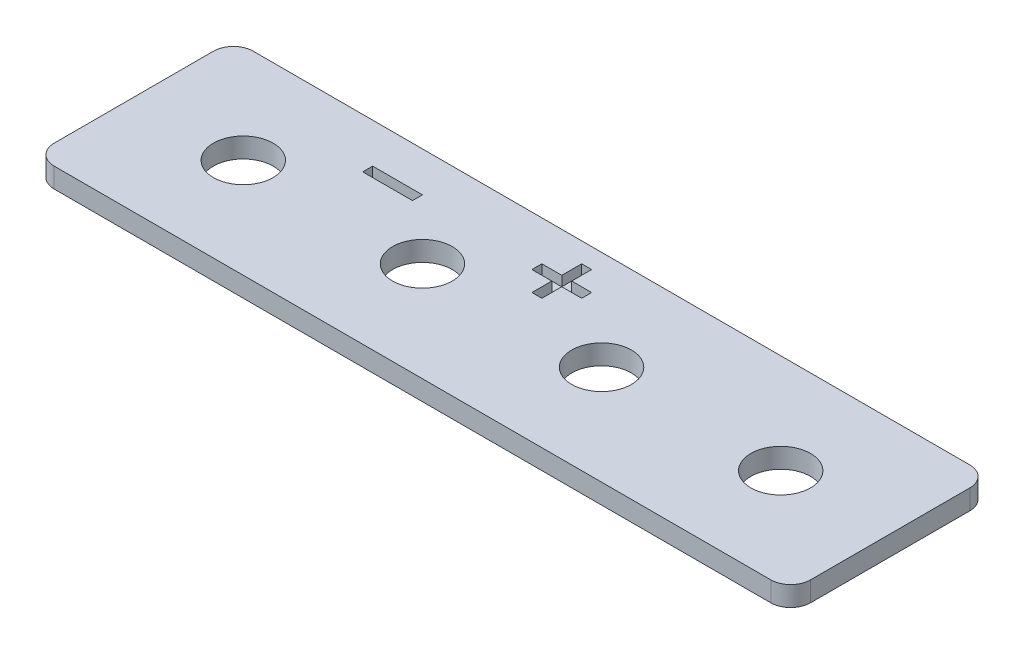
ISO-10303-21;
HEADER;
FILE_DESCRIPTION(('STEP AP214'),'2;1');
FILE_NAME('part.step','',(''),(''),'','','');
FILE_SCHEMA(('AUTOMOTIVE_DESIGN { 1 0 10303 214 1 1 1 1 }'));
ENDSEC;
DATA;
#1=APPLICATION_CONTEXT('core data for automotive mechanical design processes');
#2=APPLICATION_PROTOCOL_DEFINITION('international standard','automotive_design',2000,#1);
#3=PRODUCT_CONTEXT('',#1,'mechanical');
#4=PRODUCT('Part','Part','',(#3));
#5=PRODUCT_RELATED_PRODUCT_CATEGORY('part','',(#4));
#6=PRODUCT_DEFINITION_FORMATION('','',#4);
#7=PRODUCT_DEFINITION_CONTEXT('part definition',#1,'design');
#8=PRODUCT_DEFINITION('design','',#6,#7);
#9=PRODUCT_DEFINITION_SHAPE('','',#8);
#10=(LENGTH_UNIT() NAMED_UNIT(*) SI_UNIT(.MILLI.,.METRE.));
#11=(NAMED_UNIT(*) PLANE_ANGLE_UNIT() SI_UNIT($,.RADIAN.));
#12=(NAMED_UNIT(*) SI_UNIT($,.STERADIAN.) SOLID_ANGLE_UNIT());
#13=UNCERTAINTY_MEASURE_WITH_UNIT(LENGTH_MEASURE(1.E-05),#10,'distance_accuracy_value','');
#14=(GEOMETRIC_REPRESENTATION_CONTEXT(3) GLOBAL_UNCERTAINTY_ASSIGNED_CONTEXT((#13)) GLOBAL_UNIT_ASSIGNED_CONTEXT((#10,
#11,#12)) REPRESENTATION_CONTEXT('',''));
#15=CARTESIAN_POINT('',(0.,0.,0.));
#16=DIRECTION('',(0.,0.,1.));
#17=DIRECTION('',(1.,0.,0.));
#18=AXIS2_PLACEMENT_3D('',#15,#16,#17);
#19=CARTESIAN_POINT('',(19.,1.,5.));
#20=DIRECTION('',(-1.,0.,0.));
#21=DIRECTION('',(0.,0.,1.));
#22=AXIS2_PLACEMENT_3D('',#19,#20,#21);
#23=PLANE('',#22);
#24=DIRECTION('',(0.,0.,-1.));
#25=VECTOR('',#24,1.);
#26=CARTESIAN_POINT('',(19.,0.,5.));
#27=LINE('',#26,#25);
#28=CARTESIAN_POINT('',(19.,0.,4.));
#29=VERTEX_POINT('',#28);
#30=CARTESIAN_POINT('',(19.,0.,-4.));
#31=VERTEX_POINT('',#30);
#32=EDGE_CURVE('E350',#29,#31,#27,.T.);
#33=ORIENTED_EDGE('',*,*,#32,.T.);
#34=DIRECTION('',(0.,-1.,0.));
#35=VECTOR('',#34,1.);
#36=CARTESIAN_POINT('',(19.,1.,-4.));
#37=LINE('',#36,#35);
#38=CARTESIAN_POINT('',(19.,1.,-4.));
#39=VERTEX_POINT('',#38);
#40=EDGE_CURVE('E11',#31,#39,#37,.F.);
#41=ORIENTED_EDGE('',*,*,#40,.T.);
#42=DIRECTION('',(0.,0.,-1.));
#43=VECTOR('',#42,1.);
#44=CARTESIAN_POINT('',(19.,1.,5.));
#45=LINE('',#44,#43);
#46=CARTESIAN_POINT('',(19.,1.,4.));
#47=VERTEX_POINT('',#46);
#48=EDGE_CURVE('E353',#47,#39,#45,.T.);
#49=ORIENTED_EDGE('',*,*,#48,.F.);
#50=DIRECTION('',(0.,-1.,0.));
#51=VECTOR('',#50,1.);
#52=CARTESIAN_POINT('',(19.,1.,4.));
#53=LINE('',#52,#51);
#54=EDGE_CURVE('E44',#47,#29,#53,.T.);
#55=ORIENTED_EDGE('',*,*,#54,.T.);
#56=EDGE_LOOP('',(#33,#41,#49,#55));
#57=FACE_BOUND('',#56,.T.);
#58=ADVANCED_FACE('F36',(#57),#23,.F.);
#59=CARTESIAN_POINT('',(-19.,1.,-5.));
#60=DIRECTION('',(0.,0.,1.));
#61=DIRECTION('',(1.,0.,0.));
#62=AXIS2_PLACEMENT_3D('',#59,#60,#61);
#63=PLANE('',#62);
#64=DIRECTION('',(-1.,0.,0.));
#65=VECTOR('',#64,1.);
#66=CARTESIAN_POINT('',(-19.,0.,-5.));
#67=LINE('',#66,#65);
#68=CARTESIAN_POINT('',(18.,0.,-5.));
#69=VERTEX_POINT('',#68);
#70=CARTESIAN_POINT('',(-18.,0.,-5.));
#71=VERTEX_POINT('',#70);
#72=EDGE_CURVE('E369',#69,#71,#67,.T.);
#73=ORIENTED_EDGE('',*,*,#72,.T.);
#74=DIRECTION('',(0.,-1.,0.));
#75=VECTOR('',#74,1.);
#76=CARTESIAN_POINT('',(-18.,1.,-5.));
#77=LINE('',#76,#75);
#78=CARTESIAN_POINT('',(-18.,1.,-5.));
#79=VERTEX_POINT('',#78);
#80=EDGE_CURVE('E392',#71,#79,#77,.F.);
#81=ORIENTED_EDGE('',*,*,#80,.T.);
#82=DIRECTION('',(-1.,0.,0.));
#83=VECTOR('',#82,1.);
#84=CARTESIAN_POINT('',(-19.,1.,-5.));
#85=LINE('',#84,#83);
#86=CARTESIAN_POINT('',(18.,1.,-5.));
#87=VERTEX_POINT('',#86);
#88=EDGE_CURVE('E356',#87,#79,#85,.T.);
#89=ORIENTED_EDGE('',*,*,#88,.F.);
#90=DIRECTION('',(0.,-1.,0.));
#91=VECTOR('',#90,1.);
#92=CARTESIAN_POINT('',(18.,1.,-5.));
#93=LINE('',#92,#91);
#94=EDGE_CURVE('E389',#87,#69,#93,.T.);
#95=ORIENTED_EDGE('',*,*,#94,.T.);
#96=EDGE_LOOP('',(#73,#81,#89,#95));
#97=FACE_BOUND('',#96,.T.);
#98=ADVANCED_FACE('F425',(#97),#63,.F.);
#99=CARTESIAN_POINT('',(-19.,1.,5.));
#100=DIRECTION('',(1.,0.,0.));
#101=DIRECTION('',(0.,0.,-1.));
#102=AXIS2_PLACEMENT_3D('',#99,#100,#101);
#103=PLANE('',#102);
#104=DIRECTION('',(0.,0.,1.));
#105=VECTOR('',#104,1.);
#106=CARTESIAN_POINT('',(-19.,1.,5.));
#107=LINE('',#106,#105);
#108=CARTESIAN_POINT('',(-19.,1.,-4.));
#109=VERTEX_POINT('',#108);
#110=CARTESIAN_POINT('',(-19.,1.,4.));
#111=VERTEX_POINT('',#110);
#112=EDGE_CURVE('E360',#109,#111,#107,.T.);
#113=ORIENTED_EDGE('',*,*,#112,.F.);
#114=DIRECTION('',(0.,-1.,0.));
#115=VECTOR('',#114,1.);
#116=CARTESIAN_POINT('',(-19.,1.,-4.));
#117=LINE('',#116,#115);
#118=CARTESIAN_POINT('',(-19.,0.,-4.));
#119=VERTEX_POINT('',#118);
#120=EDGE_CURVE('E378',#109,#119,#117,.T.);
#121=ORIENTED_EDGE('',*,*,#120,.T.);
#122=DIRECTION('',(0.,0.,1.));
#123=VECTOR('',#122,1.);
#124=CARTESIAN_POINT('',(-19.,0.,5.));
#125=LINE('',#124,#123);
#126=CARTESIAN_POINT('',(-19.,0.,4.));
#127=VERTEX_POINT('',#126);
#128=EDGE_CURVE('E372',#119,#127,#125,.T.);
#129=ORIENTED_EDGE('',*,*,#128,.T.);
#130=DIRECTION('',(0.,-1.,0.));
#131=VECTOR('',#130,1.);
#132=CARTESIAN_POINT('',(-19.,1.,4.));
#133=LINE('',#132,#131);
#134=EDGE_CURVE('E366',#127,#111,#133,.F.);
#135=ORIENTED_EDGE('',*,*,#134,.T.);
#136=EDGE_LOOP('',(#113,#121,#129,#135));
#137=FACE_BOUND('',#136,.T.);
#138=ADVANCED_FACE('F435',(#137),#103,.F.);
#139=CARTESIAN_POINT('',(-19.,1.,5.));
#140=DIRECTION('',(0.,0.,-1.));
#141=DIRECTION('',(-1.,0.,0.));
#142=AXIS2_PLACEMENT_3D('',#139,#140,#141);
#143=PLANE('',#142);
#144=DIRECTION('',(1.,0.,0.));
#145=VECTOR('',#144,1.);
#146=CARTESIAN_POINT('',(-19.,1.,5.));
#147=LINE('',#146,#145);
#148=CARTESIAN_POINT('',(-18.,1.,5.));
#149=VERTEX_POINT('',#148);
#150=CARTESIAN_POINT('',(18.,1.,5.));
#151=VERTEX_POINT('',#150);
#152=EDGE_CURVE('E363',#149,#151,#147,.T.);
#153=ORIENTED_EDGE('',*,*,#152,.F.);
#154=DIRECTION('',(0.,-1.,0.));
#155=VECTOR('',#154,1.);
#156=CARTESIAN_POINT('',(-18.,1.,5.));
#157=LINE('',#156,#155);
#158=CARTESIAN_POINT('',(-18.,0.,5.));
#159=VERTEX_POINT('',#158);
#160=EDGE_CURVE('E404',#149,#159,#157,.T.);
#161=ORIENTED_EDGE('',*,*,#160,.T.);
#162=DIRECTION('',(1.,0.,0.));
#163=VECTOR('',#162,1.);
#164=CARTESIAN_POINT('',(-19.,0.,5.));
#165=LINE('',#164,#163);
#166=CARTESIAN_POINT('',(18.,0.,5.));
#167=VERTEX_POINT('',#166);
#168=EDGE_CURVE('E357',#159,#167,#165,.T.);
#169=ORIENTED_EDGE('',*,*,#168,.T.);
#170=DIRECTION('',(0.,-1.,0.));
#171=VECTOR('',#170,1.);
#172=CARTESIAN_POINT('',(18.,1.,5.));
#173=LINE('',#172,#171);
#174=EDGE_CURVE('E402',#167,#151,#173,.F.);
#175=ORIENTED_EDGE('',*,*,#174,.T.);
#176=EDGE_LOOP('',(#153,#161,#169,#175));
#177=FACE_BOUND('',#176,.T.);
#178=ADVANCED_FACE('F443',(#177),#143,.F.);
#179=CARTESIAN_POINT('',(0.,1.,0.));
#180=DIRECTION('',(0.,-1.,0.));
#181=DIRECTION('',(0.,0.,-1.));
#182=AXIS2_PLACEMENT_3D('',#179,#180,#181);
#183=PLANE('',#182);
#184=DIRECTION('',(1.,0.,0.));
#185=VECTOR('',#184,1.);
#186=CARTESIAN_POINT('',(-1.5,1.,-2.5));
#187=LINE('',#186,#185);
#188=CARTESIAN_POINT('',(-1.5,1.,-2.5));
#189=VERTEX_POINT('',#188);
#190=CARTESIAN_POINT('',(-0.499999999999998,1.,-2.5));
#191=VERTEX_POINT('',#190);
#192=EDGE_CURVE('E249',#189,#191,#187,.T.);
#193=ORIENTED_EDGE('',*,*,#192,.F.);
#194=DIRECTION('',(0.,0.,1.));
#195=VECTOR('',#194,1.);
#196=CARTESIAN_POINT('',(-1.5,1.,-3.));
#197=LINE('',#196,#195);
#198=CARTESIAN_POINT('',(-1.5,1.,-3.));
#199=VERTEX_POINT('',#198);
#200=EDGE_CURVE('E51',#199,#189,#197,.T.);
#201=ORIENTED_EDGE('',*,*,#200,.F.);
#202=DIRECTION('',(-1.,0.,0.));
#203=VECTOR('',#202,1.);
#204=CARTESIAN_POINT('',(-1.5,1.,-3.));
#205=LINE('',#204,#203);
#206=CARTESIAN_POINT('',(-0.499999999999998,1.,-3.));
#207=VERTEX_POINT('',#206);
#208=EDGE_CURVE('E217',#207,#199,#205,.T.);
#209=ORIENTED_EDGE('',*,*,#208,.F.);
#210=DIRECTION('',(0.,0.,1.));
#211=VECTOR('',#210,1.);
#212=CARTESIAN_POINT('',(-0.499999999999998,1.,-4.));
#213=LINE('',#212,#211);
#214=CARTESIAN_POINT('',(-0.499999999999998,1.,-4.));
#215=VERTEX_POINT('',#214);
#216=EDGE_CURVE('E220',#215,#207,#213,.T.);
#217=ORIENTED_EDGE('',*,*,#216,.F.);
#218=DIRECTION('',(-1.,0.,0.));
#219=VECTOR('',#218,1.);
#220=CARTESIAN_POINT('',(-0.499999999999998,1.,-4.));
#221=LINE('',#220,#219);
#222=CARTESIAN_POINT('',(0.,1.,-4.));
#223=VERTEX_POINT('',#222);
#224=EDGE_CURVE('E272',#223,#215,#221,.T.);
#225=ORIENTED_EDGE('',*,*,#224,.F.);
#226=DIRECTION('',(0.,0.,-1.));
#227=VECTOR('',#226,1.);
#228=CARTESIAN_POINT('',(0.,1.,-4.));
#229=LINE('',#228,#227);
#230=CARTESIAN_POINT('',(0.,1.,-3.));
#231=VERTEX_POINT('',#230);
#232=EDGE_CURVE('E269',#231,#223,#229,.T.);
#233=ORIENTED_EDGE('',*,*,#232,.F.);
#234=DIRECTION('',(-1.,0.,0.));
#235=VECTOR('',#234,1.);
#236=CARTESIAN_POINT('',(0.,1.,-3.));
#237=LINE('',#236,#235);
#238=CARTESIAN_POINT('',(1.,1.,-3.));
#239=VERTEX_POINT('',#238);
#240=EDGE_CURVE('E266',#239,#231,#237,.T.);
#241=ORIENTED_EDGE('',*,*,#240,.F.);
#242=DIRECTION('',(0.,0.,-1.));
#243=VECTOR('',#242,1.);
#244=CARTESIAN_POINT('',(1.,1.,-3.));
#245=LINE('',#244,#243);
#246=CARTESIAN_POINT('',(1.,1.,-2.5));
#247=VERTEX_POINT('',#246);
#248=EDGE_CURVE('E263',#247,#239,#245,.T.);
#249=ORIENTED_EDGE('',*,*,#248,.F.);
#250=DIRECTION('',(1.,0.,0.));
#251=VECTOR('',#250,1.);
#252=CARTESIAN_POINT('',(0.,1.,-2.5));
#253=LINE('',#252,#251);
#254=CARTESIAN_POINT('',(0.,1.,-2.5));
#255=VERTEX_POINT('',#254);
#256=EDGE_CURVE('E260',#255,#247,#253,.T.);
#257=ORIENTED_EDGE('',*,*,#256,.F.);
#258=DIRECTION('',(0.,0.,-1.));
#259=VECTOR('',#258,1.);
#260=CARTESIAN_POINT('',(0.,1.,-2.5));
#261=LINE('',#260,#259);
#262=CARTESIAN_POINT('',(0.,1.,-1.5));
#263=VERTEX_POINT('',#262);
#264=EDGE_CURVE('E257',#263,#255,#261,.T.);
#265=ORIENTED_EDGE('',*,*,#264,.F.);
#266=DIRECTION('',(1.,0.,0.));
#267=VECTOR('',#266,1.);
#268=CARTESIAN_POINT('',(-0.499999999999998,1.,-1.5));
#269=LINE('',#268,#267);
#270=CARTESIAN_POINT('',(-0.499999999999998,1.,-1.5));
#271=VERTEX_POINT('',#270);
#272=EDGE_CURVE('E254',#271,#263,#269,.T.);
#273=ORIENTED_EDGE('',*,*,#272,.F.);
#274=DIRECTION('',(0.,0.,1.));
#275=VECTOR('',#274,1.);
#276=CARTESIAN_POINT('',(-0.499999999999998,1.,-2.5));
#277=LINE('',#276,#275);
#278=EDGE_CURVE('E251',#191,#271,#277,.T.);
#279=ORIENTED_EDGE('',*,*,#278,.F.);
#280=EDGE_LOOP('',(#193,#201,#209,#217,#225,#233,#241,#249,#257,#265,#273,#279));
#281=FACE_BOUND('',#280,.T.);
#282=DIRECTION('',(1.,0.,0.));
#283=VECTOR('',#282,1.);
#284=CARTESIAN_POINT('',(-10.,1.,-2.5));
#285=LINE('',#284,#283);
#286=CARTESIAN_POINT('',(-10.,1.,-2.5));
#287=VERTEX_POINT('',#286);
#288=CARTESIAN_POINT('',(-7.5,1.,-2.5));
#289=VERTEX_POINT('',#288);
#290=EDGE_CURVE('E313',#287,#289,#285,.T.);
#291=ORIENTED_EDGE('',*,*,#290,.F.);
#292=DIRECTION('',(0.,0.,1.));
#293=VECTOR('',#292,1.);
#294=CARTESIAN_POINT('',(-10.,1.,-3.));
#295=LINE('',#294,#293);
#296=CARTESIAN_POINT('',(-10.,1.,-3.));
#297=VERTEX_POINT('',#296);
#298=EDGE_CURVE('E59',#297,#287,#295,.T.);
#299=ORIENTED_EDGE('',*,*,#298,.F.);
#300=DIRECTION('',(-1.,0.,0.));
#301=VECTOR('',#300,1.);
#302=CARTESIAN_POINT('',(-10.,1.,-3.));
#303=LINE('',#302,#301);
#304=CARTESIAN_POINT('',(-7.5,1.,-3.));
#305=VERTEX_POINT('',#304);
#306=EDGE_CURVE('E302',#305,#297,#303,.T.);
#307=ORIENTED_EDGE('',*,*,#306,.F.);
#308=DIRECTION('',(0.,0.,-1.));
#309=VECTOR('',#308,1.);
#310=CARTESIAN_POINT('',(-7.5,1.,-3.));
#311=LINE('',#310,#309);
#312=EDGE_CURVE('E316',#289,#305,#311,.T.);
#313=ORIENTED_EDGE('',*,*,#312,.F.);
#314=EDGE_LOOP('',(#291,#299,#307,#313));
#315=FACE_BOUND('',#314,.T.);
#316=CARTESIAN_POINT('',(13.5,1.,0.));
#317=DIRECTION('',(0.,1.,0.));
#318=DIRECTION('',(0.,0.,1.));
#319=AXIS2_PLACEMENT_3D('',#316,#317,#318);
#320=CIRCLE('',#319,1.5);
#321=CARTESIAN_POINT('',(13.5,1.,1.5));
#322=VERTEX_POINT('',#321);
#323=EDGE_CURVE('E323',#322,#322,#320,.T.);
#324=ORIENTED_EDGE('',*,*,#323,.F.);
#325=EDGE_LOOP('',(#324));
#326=FACE_BOUND('',#325,.T.);
#327=CARTESIAN_POINT('',(4.5,1.,0.));
#328=DIRECTION('',(0.,1.,0.));
#329=DIRECTION('',(0.,0.,1.));
#330=AXIS2_PLACEMENT_3D('',#327,#328,#329);
#331=CIRCLE('',#330,1.5);
#332=CARTESIAN_POINT('',(4.5,1.,1.5));
#333=VERTEX_POINT('',#332);
#334=EDGE_CURVE('E332',#333,#333,#331,.T.);
#335=ORIENTED_EDGE('',*,*,#334,.F.);
#336=EDGE_LOOP('',(#335));
#337=FACE_BOUND('',#336,.T.);
#338=CARTESIAN_POINT('',(-4.5,1.,0.));
#339=DIRECTION('',(0.,1.,0.));
#340=DIRECTION('',(0.,0.,1.));
#341=AXIS2_PLACEMENT_3D('',#338,#339,#340);
#342=CIRCLE('',#341,1.5);
#343=CARTESIAN_POINT('',(-4.5,1.,1.5));
#344=VERTEX_POINT('',#343);
#345=EDGE_CURVE('E338',#344,#344,#342,.T.);
#346=ORIENTED_EDGE('',*,*,#345,.F.);
#347=EDGE_LOOP('',(#346));
#348=FACE_BOUND('',#347,.T.);
#349=CARTESIAN_POINT('',(-13.5,1.,0.));
#350=DIRECTION('',(0.,1.,0.));
#351=DIRECTION('',(0.,0.,1.));
#352=AXIS2_PLACEMENT_3D('',#349,#350,#351);
#353=CIRCLE('',#352,1.5);
#354=CARTESIAN_POINT('',(-13.5,1.,1.5));
#355=VERTEX_POINT('',#354);
#356=EDGE_CURVE('E344',#355,#355,#353,.T.);
#357=ORIENTED_EDGE('',*,*,#356,.F.);
#358=EDGE_LOOP('',(#357));
#359=FACE_BOUND('',#358,.T.);
#360=ORIENTED_EDGE('',*,*,#88,.T.);
#361=CARTESIAN_POINT('',(-18.,1.,-4.));
#362=DIRECTION('',(0.,-1.,0.));
#363=DIRECTION('',(0.,0.,-1.));
#364=AXIS2_PLACEMENT_3D('',#361,#362,#363);
#365=CIRCLE('',#364,1.);
#366=EDGE_CURVE('E400',#79,#109,#365,.F.);
#367=ORIENTED_EDGE('',*,*,#366,.T.);
#368=ORIENTED_EDGE('',*,*,#112,.T.);
#369=CARTESIAN_POINT('',(-18.,1.,4.));
#370=DIRECTION('',(0.,-1.,0.));
#371=DIRECTION('',(0.,0.,-1.));
#372=AXIS2_PLACEMENT_3D('',#369,#370,#371);
#373=CIRCLE('',#372,1.);
#374=EDGE_CURVE('E398',#111,#149,#373,.F.);
#375=ORIENTED_EDGE('',*,*,#374,.T.);
#376=ORIENTED_EDGE('',*,*,#152,.T.);
#377=CARTESIAN_POINT('',(18.,1.,4.));
#378=DIRECTION('',(0.,-1.,0.));
#379=DIRECTION('',(0.,0.,-1.));
#380=AXIS2_PLACEMENT_3D('',#377,#378,#379);
#381=CIRCLE('',#380,1.);
#382=EDGE_CURVE('E394',#151,#47,#381,.F.);
#383=ORIENTED_EDGE('',*,*,#382,.T.);
#384=ORIENTED_EDGE('',*,*,#48,.T.);
#385=CARTESIAN_POINT('',(18.,1.,-4.));
#386=DIRECTION('',(0.,-1.,0.));
#387=DIRECTION('',(0.,0.,-1.));
#388=AXIS2_PLACEMENT_3D('',#385,#386,#387);
#389=CIRCLE('',#388,1.);
#390=EDGE_CURVE('E396',#39,#87,#389,.F.);
#391=ORIENTED_EDGE('',*,*,#390,.T.);
#392=EDGE_LOOP('',(#360,#367,#368,#375,#376,#383,#384,#391));
#393=FACE_BOUND('',#392,.T.);
#394=ADVANCED_FACE('F429',(#281,#315,#326,#337,#348,#359,#393),#183,.F.);
#395=CARTESIAN_POINT('',(0.,0.,0.));
#396=DIRECTION('',(0.,-1.,0.));
#397=DIRECTION('',(0.,0.,-1.));
#398=AXIS2_PLACEMENT_3D('',#395,#396,#397);
#399=PLANE('',#398);
#400=CARTESIAN_POINT('',(13.5,0.,0.));
#401=DIRECTION('',(0.,1.,0.));
#402=DIRECTION('',(0.,0.,1.));
#403=AXIS2_PLACEMENT_3D('',#400,#401,#402);
#404=CIRCLE('',#403,1.5);
#405=CARTESIAN_POINT('',(13.5,0.,1.5));
#406=VERTEX_POINT('',#405);
#407=EDGE_CURVE('E329',#406,#406,#404,.T.);
#408=ORIENTED_EDGE('',*,*,#407,.T.);
#409=EDGE_LOOP('',(#408));
#410=FACE_BOUND('',#409,.T.);
#411=CARTESIAN_POINT('',(4.5,0.,0.));
#412=DIRECTION('',(0.,1.,0.));
#413=DIRECTION('',(0.,0.,1.));
#414=AXIS2_PLACEMENT_3D('',#411,#412,#413);
#415=CIRCLE('',#414,1.5);
#416=CARTESIAN_POINT('',(4.5,0.,1.5));
#417=VERTEX_POINT('',#416);
#418=EDGE_CURVE('E335',#417,#417,#415,.T.);
#419=ORIENTED_EDGE('',*,*,#418,.T.);
#420=EDGE_LOOP('',(#419));
#421=FACE_BOUND('',#420,.T.);
#422=CARTESIAN_POINT('',(-4.5,0.,0.));
#423=DIRECTION('',(0.,1.,0.));
#424=DIRECTION('',(0.,0.,1.));
#425=AXIS2_PLACEMENT_3D('',#422,#423,#424);
#426=CIRCLE('',#425,1.5);
#427=CARTESIAN_POINT('',(-4.5,0.,1.5));
#428=VERTEX_POINT('',#427);
#429=EDGE_CURVE('E341',#428,#428,#426,.T.);
#430=ORIENTED_EDGE('',*,*,#429,.T.);
#431=EDGE_LOOP('',(#430));
#432=FACE_BOUND('',#431,.T.);
#433=CARTESIAN_POINT('',(-13.5,0.,0.));
#434=DIRECTION('',(0.,1.,0.));
#435=DIRECTION('',(0.,0.,1.));
#436=AXIS2_PLACEMENT_3D('',#433,#434,#435);
#437=CIRCLE('',#436,1.5);
#438=CARTESIAN_POINT('',(-13.5,0.,1.5));
#439=VERTEX_POINT('',#438);
#440=EDGE_CURVE('E347',#439,#439,#437,.T.);
#441=ORIENTED_EDGE('',*,*,#440,.T.);
#442=EDGE_LOOP('',(#441));
#443=FACE_BOUND('',#442,.T.);
#444=ORIENTED_EDGE('',*,*,#128,.F.);
#445=CARTESIAN_POINT('',(-18.,0.,-4.));
#446=DIRECTION('',(0.,-1.,0.));
#447=DIRECTION('',(0.,0.,-1.));
#448=AXIS2_PLACEMENT_3D('',#445,#446,#447);
#449=CIRCLE('',#448,1.);
#450=EDGE_CURVE('E387',#119,#71,#449,.T.);
#451=ORIENTED_EDGE('',*,*,#450,.T.);
#452=ORIENTED_EDGE('',*,*,#72,.F.);
#453=CARTESIAN_POINT('',(18.,0.,-4.));
#454=DIRECTION('',(0.,-1.,0.));
#455=DIRECTION('',(0.,0.,-1.));
#456=AXIS2_PLACEMENT_3D('',#453,#454,#455);
#457=CIRCLE('',#456,1.);
#458=EDGE_CURVE('E383',#69,#31,#457,.T.);
#459=ORIENTED_EDGE('',*,*,#458,.T.);
#460=ORIENTED_EDGE('',*,*,#32,.F.);
#461=CARTESIAN_POINT('',(18.,0.,4.));
#462=DIRECTION('',(0.,-1.,0.));
#463=DIRECTION('',(0.,0.,-1.));
#464=AXIS2_PLACEMENT_3D('',#461,#462,#463);
#465=CIRCLE('',#464,1.);
#466=EDGE_CURVE('E381',#29,#167,#465,.T.);
#467=ORIENTED_EDGE('',*,*,#466,.T.);
#468=ORIENTED_EDGE('',*,*,#168,.F.);
#469=CARTESIAN_POINT('',(-18.,0.,4.));
#470=DIRECTION('',(0.,-1.,0.));
#471=DIRECTION('',(0.,0.,-1.));
#472=AXIS2_PLACEMENT_3D('',#469,#470,#471);
#473=CIRCLE('',#472,1.);
#474=EDGE_CURVE('E385',#159,#127,#473,.T.);
#475=ORIENTED_EDGE('',*,*,#474,.T.);
#476=EDGE_LOOP('',(#444,#451,#452,#459,#460,#467,#468,#475));
#477=FACE_BOUND('',#476,.T.);
#478=ADVANCED_FACE('F416',(#410,#421,#432,#443,#477),#399,.T.);
#479=CARTESIAN_POINT('',(-18.,1.,-4.));
#480=DIRECTION('',(0.,-1.,0.));
#481=DIRECTION('',(0.,0.,-1.));
#482=AXIS2_PLACEMENT_3D('',#479,#480,#481);
#483=CYLINDRICAL_SURFACE('',#482,1.);
#484=ORIENTED_EDGE('',*,*,#366,.F.);
#485=ORIENTED_EDGE('',*,*,#80,.F.);
#486=ORIENTED_EDGE('',*,*,#450,.F.);
#487=ORIENTED_EDGE('',*,*,#120,.F.);
#488=EDGE_LOOP('',(#484,#485,#486,#487));
#489=FACE_BOUND('',#488,.T.);
#490=ADVANCED_FACE('F433',(#489),#483,.T.);
#491=CARTESIAN_POINT('',(-18.,1.,4.));
#492=DIRECTION('',(0.,-1.,0.));
#493=DIRECTION('',(0.,0.,-1.));
#494=AXIS2_PLACEMENT_3D('',#491,#492,#493);
#495=CYLINDRICAL_SURFACE('',#494,1.);
#496=ORIENTED_EDGE('',*,*,#374,.F.);
#497=ORIENTED_EDGE('',*,*,#134,.F.);
#498=ORIENTED_EDGE('',*,*,#474,.F.);
#499=ORIENTED_EDGE('',*,*,#160,.F.);
#500=EDGE_LOOP('',(#496,#497,#498,#499));
#501=FACE_BOUND('',#500,.T.);
#502=ADVANCED_FACE('F440',(#501),#495,.T.);
#503=CARTESIAN_POINT('',(18.,1.,-4.));
#504=DIRECTION('',(0.,-1.,0.));
#505=DIRECTION('',(0.,0.,-1.));
#506=AXIS2_PLACEMENT_3D('',#503,#504,#505);
#507=CYLINDRICAL_SURFACE('',#506,1.);
#508=ORIENTED_EDGE('',*,*,#390,.F.);
#509=ORIENTED_EDGE('',*,*,#40,.F.);
#510=ORIENTED_EDGE('',*,*,#458,.F.);
#511=ORIENTED_EDGE('',*,*,#94,.F.);
#512=EDGE_LOOP('',(#508,#509,#510,#511));
#513=FACE_BOUND('',#512,.T.);
#514=ADVANCED_FACE('F422',(#513),#507,.T.);
#515=CARTESIAN_POINT('',(18.,1.,4.));
#516=DIRECTION('',(0.,-1.,0.));
#517=DIRECTION('',(0.,0.,-1.));
#518=AXIS2_PLACEMENT_3D('',#515,#516,#517);
#519=CYLINDRICAL_SURFACE('',#518,1.);
#520=ORIENTED_EDGE('',*,*,#382,.F.);
#521=ORIENTED_EDGE('',*,*,#174,.F.);
#522=ORIENTED_EDGE('',*,*,#466,.F.);
#523=ORIENTED_EDGE('',*,*,#54,.F.);
#524=EDGE_LOOP('',(#520,#521,#522,#523));
#525=FACE_BOUND('',#524,.T.);
#526=ADVANCED_FACE('F38',(#525),#519,.T.);
#527=CARTESIAN_POINT('',(-13.5,0.,0.));
#528=DIRECTION('',(0.,1.,0.));
#529=DIRECTION('',(0.,0.,1.));
#530=AXIS2_PLACEMENT_3D('',#527,#528,#529);
#531=CYLINDRICAL_SURFACE('',#530,1.5);
#532=ORIENTED_EDGE('',*,*,#440,.F.);
#533=EDGE_LOOP('',(#532));
#534=FACE_BOUND('',#533,.T.);
#535=ORIENTED_EDGE('',*,*,#356,.T.);
#536=EDGE_LOOP('',(#535));
#537=FACE_BOUND('',#536,.T.);
#538=ADVANCED_FACE('F446',(#534,#537),#531,.F.);
#539=CARTESIAN_POINT('',(-4.5,0.,0.));
#540=DIRECTION('',(0.,1.,0.));
#541=DIRECTION('',(0.,0.,1.));
#542=AXIS2_PLACEMENT_3D('',#539,#540,#541);
#543=CYLINDRICAL_SURFACE('',#542,1.5);
#544=ORIENTED_EDGE('',*,*,#429,.F.);
#545=EDGE_LOOP('',(#544));
#546=FACE_BOUND('',#545,.T.);
#547=ORIENTED_EDGE('',*,*,#345,.T.);
#548=EDGE_LOOP('',(#547));
#549=FACE_BOUND('',#548,.T.);
#550=ADVANCED_FACE('F451',(#546,#549),#543,.F.);
#551=CARTESIAN_POINT('',(4.5,0.,0.));
#552=DIRECTION('',(0.,1.,0.));
#553=DIRECTION('',(0.,0.,1.));
#554=AXIS2_PLACEMENT_3D('',#551,#552,#553);
#555=CYLINDRICAL_SURFACE('',#554,1.5);
#556=ORIENTED_EDGE('',*,*,#418,.F.);
#557=EDGE_LOOP('',(#556));
#558=FACE_BOUND('',#557,.T.);
#559=ORIENTED_EDGE('',*,*,#334,.T.);
#560=EDGE_LOOP('',(#559));
#561=FACE_BOUND('',#560,.T.);
#562=ADVANCED_FACE('F504',(#558,#561),#555,.F.);
#563=CARTESIAN_POINT('',(13.5,0.,0.));
#564=DIRECTION('',(0.,1.,0.));
#565=DIRECTION('',(0.,0.,1.));
#566=AXIS2_PLACEMENT_3D('',#563,#564,#565);
#567=CYLINDRICAL_SURFACE('',#566,1.5);
#568=ORIENTED_EDGE('',*,*,#407,.F.);
#569=EDGE_LOOP('',(#568));
#570=FACE_BOUND('',#569,.T.);
#571=ORIENTED_EDGE('',*,*,#323,.T.);
#572=EDGE_LOOP('',(#571));
#573=FACE_BOUND('',#572,.T.);
#574=ADVANCED_FACE('F514',(#570,#573),#567,.F.);
#575=CARTESIAN_POINT('',(-10.,0.5,-3.));
#576=DIRECTION('',(-1.,0.,0.));
#577=DIRECTION('',(0.,0.,1.));
#578=AXIS2_PLACEMENT_3D('',#575,#576,#577);
#579=PLANE('',#578);
#580=ORIENTED_EDGE('',*,*,#298,.T.);
#581=DIRECTION('',(0.,1.,0.));
#582=VECTOR('',#581,1.);
#583=CARTESIAN_POINT('',(-10.,0.5,-2.5));
#584=LINE('',#583,#582);
#585=CARTESIAN_POINT('',(-10.,0.5,-2.5));
#586=VERTEX_POINT('',#585);
#587=EDGE_CURVE('E311',#586,#287,#584,.T.);
#588=ORIENTED_EDGE('',*,*,#587,.F.);
#589=DIRECTION('',(0.,0.,1.));
#590=VECTOR('',#589,1.);
#591=CARTESIAN_POINT('',(-10.,0.5,-3.));
#592=LINE('',#591,#590);
#593=CARTESIAN_POINT('',(-10.,0.5,-3.));
#594=VERTEX_POINT('',#593);
#595=EDGE_CURVE('E298',#594,#586,#592,.T.);
#596=ORIENTED_EDGE('',*,*,#595,.F.);
#597=DIRECTION('',(0.,1.,0.));
#598=VECTOR('',#597,1.);
#599=CARTESIAN_POINT('',(-10.,0.5,-3.));
#600=LINE('',#599,#598);
#601=EDGE_CURVE('E321',#594,#297,#600,.T.);
#602=ORIENTED_EDGE('',*,*,#601,.T.);
#603=EDGE_LOOP('',(#580,#588,#596,#602));
#604=FACE_BOUND('',#603,.T.);
#605=ADVANCED_FACE('F524',(#604),#579,.F.);
#606=CARTESIAN_POINT('',(-10.,0.5,-3.));
#607=DIRECTION('',(0.,0.,-1.));
#608=DIRECTION('',(-1.,0.,0.));
#609=AXIS2_PLACEMENT_3D('',#606,#607,#608);
#610=PLANE('',#609);
#611=ORIENTED_EDGE('',*,*,#306,.T.);
#612=ORIENTED_EDGE('',*,*,#601,.F.);
#613=DIRECTION('',(-1.,0.,0.));
#614=VECTOR('',#613,1.);
#615=CARTESIAN_POINT('',(-10.,0.5,-3.));
#616=LINE('',#615,#614);
#617=CARTESIAN_POINT('',(-7.5,0.5,-3.));
#618=VERTEX_POINT('',#617);
#619=EDGE_CURVE('E308',#618,#594,#616,.T.);
#620=ORIENTED_EDGE('',*,*,#619,.F.);
#621=DIRECTION('',(0.,1.,0.));
#622=VECTOR('',#621,1.);
#623=CARTESIAN_POINT('',(-7.5,0.5,-3.));
#624=LINE('',#623,#622);
#625=EDGE_CURVE('E324',#618,#305,#624,.T.);
#626=ORIENTED_EDGE('',*,*,#625,.T.);
#627=EDGE_LOOP('',(#611,#612,#620,#626));
#628=FACE_BOUND('',#627,.T.);
#629=ADVANCED_FACE('F543',(#628),#610,.F.);
#630=CARTESIAN_POINT('',(-7.5,0.5,-3.));
#631=DIRECTION('',(1.,0.,0.));
#632=DIRECTION('',(0.,0.,-1.));
#633=AXIS2_PLACEMENT_3D('',#630,#631,#632);
#634=PLANE('',#633);
#635=ORIENTED_EDGE('',*,*,#312,.T.);
#636=ORIENTED_EDGE('',*,*,#625,.F.);
#637=DIRECTION('',(0.,0.,-1.));
#638=VECTOR('',#637,1.);
#639=CARTESIAN_POINT('',(-7.5,0.5,-3.));
#640=LINE('',#639,#638);
#641=CARTESIAN_POINT('',(-7.5,0.5,-2.5));
#642=VERTEX_POINT('',#641);
#643=EDGE_CURVE('E305',#642,#618,#640,.T.);
#644=ORIENTED_EDGE('',*,*,#643,.F.);
#645=DIRECTION('',(0.,1.,0.));
#646=VECTOR('',#645,1.);
#647=CARTESIAN_POINT('',(-7.5,0.5,-2.5));
#648=LINE('',#647,#646);
#649=EDGE_CURVE('E326',#642,#289,#648,.T.);
#650=ORIENTED_EDGE('',*,*,#649,.T.);
#651=EDGE_LOOP('',(#635,#636,#644,#650));
#652=FACE_BOUND('',#651,.T.);
#653=ADVANCED_FACE('F552',(#652),#634,.F.);
#654=CARTESIAN_POINT('',(-10.,0.5,-2.5));
#655=DIRECTION('',(0.,0.,1.));
#656=DIRECTION('',(1.,0.,0.));
#657=AXIS2_PLACEMENT_3D('',#654,#655,#656);
#658=PLANE('',#657);
#659=ORIENTED_EDGE('',*,*,#290,.T.);
#660=ORIENTED_EDGE('',*,*,#649,.F.);
#661=DIRECTION('',(1.,0.,0.));
#662=VECTOR('',#661,1.);
#663=CARTESIAN_POINT('',(-10.,0.5,-2.5));
#664=LINE('',#663,#662);
#665=EDGE_CURVE('E301',#586,#642,#664,.T.);
#666=ORIENTED_EDGE('',*,*,#665,.F.);
#667=ORIENTED_EDGE('',*,*,#587,.T.);
#668=EDGE_LOOP('',(#659,#660,#666,#667));
#669=FACE_BOUND('',#668,.T.);
#670=ADVANCED_FACE('F562',(#669),#658,.F.);
#671=CARTESIAN_POINT('',(0.,0.5,0.));
#672=DIRECTION('',(0.,1.,0.));
#673=DIRECTION('',(0.,0.,1.));
#674=AXIS2_PLACEMENT_3D('',#671,#672,#673);
#675=PLANE('',#674);
#676=ORIENTED_EDGE('',*,*,#595,.T.);
#677=ORIENTED_EDGE('',*,*,#665,.T.);
#678=ORIENTED_EDGE('',*,*,#643,.T.);
#679=ORIENTED_EDGE('',*,*,#619,.T.);
#680=EDGE_LOOP('',(#676,#677,#678,#679));
#681=FACE_BOUND('',#680,.T.);
#682=ADVANCED_FACE('F572',(#681),#675,.T.);
#683=CARTESIAN_POINT('',(-1.5,0.5,-3.));
#684=DIRECTION('',(-1.,0.,0.));
#685=DIRECTION('',(0.,0.,1.));
#686=AXIS2_PLACEMENT_3D('',#683,#684,#685);
#687=PLANE('',#686);
#688=ORIENTED_EDGE('',*,*,#200,.T.);
#689=DIRECTION('',(0.,1.,0.));
#690=VECTOR('',#689,1.);
#691=CARTESIAN_POINT('',(-1.5,0.5,-2.5));
#692=LINE('',#691,#690);
#693=CARTESIAN_POINT('',(-1.5,0.5,-2.5));
#694=VERTEX_POINT('',#693);
#695=EDGE_CURVE('E194',#694,#189,#692,.T.);
#696=ORIENTED_EDGE('',*,*,#695,.F.);
#697=DIRECTION('',(0.,0.,1.));
#698=VECTOR('',#697,1.);
#699=CARTESIAN_POINT('',(-1.5,0.5,-3.));
#700=LINE('',#699,#698);
#701=CARTESIAN_POINT('',(-1.5,0.5,-3.));
#702=VERTEX_POINT('',#701);
#703=EDGE_CURVE('E198',#702,#694,#700,.T.);
#704=ORIENTED_EDGE('',*,*,#703,.F.);
#705=DIRECTION('',(0.,1.,0.));
#706=VECTOR('',#705,1.);
#707=CARTESIAN_POINT('',(-1.5,0.5,-3.));
#708=LINE('',#707,#706);
#709=EDGE_CURVE('E277',#702,#199,#708,.T.);
#710=ORIENTED_EDGE('',*,*,#709,.T.);
#711=EDGE_LOOP('',(#688,#696,#704,#710));
#712=FACE_BOUND('',#711,.T.);
#713=ADVANCED_FACE('F196',(#712),#687,.F.);
#714=CARTESIAN_POINT('',(-1.5,0.5,-3.));
#715=DIRECTION('',(0.,0.,-1.));
#716=DIRECTION('',(-1.,0.,0.));
#717=AXIS2_PLACEMENT_3D('',#714,#715,#716);
#718=PLANE('',#717);
#719=ORIENTED_EDGE('',*,*,#208,.T.);
#720=ORIENTED_EDGE('',*,*,#709,.F.);
#721=DIRECTION('',(-1.,0.,0.));
#722=VECTOR('',#721,1.);
#723=CARTESIAN_POINT('',(-1.5,0.5,-3.));
#724=LINE('',#723,#722);
#725=CARTESIAN_POINT('',(-0.499999999999998,0.5,-3.));
#726=VERTEX_POINT('',#725);
#727=EDGE_CURVE('E204',#726,#702,#724,.T.);
#728=ORIENTED_EDGE('',*,*,#727,.F.);
#729=DIRECTION('',(0.,1.,0.));
#730=VECTOR('',#729,1.);
#731=CARTESIAN_POINT('',(-0.499999999999998,0.5,-3.));
#732=LINE('',#731,#730);
#733=EDGE_CURVE('E279',#726,#207,#732,.T.);
#734=ORIENTED_EDGE('',*,*,#733,.T.);
#735=EDGE_LOOP('',(#719,#720,#728,#734));
#736=FACE_BOUND('',#735,.T.);
#737=ADVANCED_FACE('F591',(#736),#718,.F.);
#738=CARTESIAN_POINT('',(-0.499999999999998,0.5,-4.));
#739=DIRECTION('',(-1.,0.,0.));
#740=DIRECTION('',(0.,0.,1.));
#741=AXIS2_PLACEMENT_3D('',#738,#739,#740);
#742=PLANE('',#741);
#743=ORIENTED_EDGE('',*,*,#216,.T.);
#744=ORIENTED_EDGE('',*,*,#733,.F.);
#745=DIRECTION('',(0.,0.,1.));
#746=VECTOR('',#745,1.);
#747=CARTESIAN_POINT('',(-0.499999999999998,0.5,-4.));
#748=LINE('',#747,#746);
#749=CARTESIAN_POINT('',(-0.499999999999998,0.5,-4.));
#750=VERTEX_POINT('',#749);
#751=EDGE_CURVE('E245',#750,#726,#748,.T.);
#752=ORIENTED_EDGE('',*,*,#751,.F.);
#753=DIRECTION('',(0.,1.,0.));
#754=VECTOR('',#753,1.);
#755=CARTESIAN_POINT('',(-0.499999999999998,0.5,-4.));
#756=LINE('',#755,#754);
#757=EDGE_CURVE('E281',#750,#215,#756,.T.);
#758=ORIENTED_EDGE('',*,*,#757,.T.);
#759=EDGE_LOOP('',(#743,#744,#752,#758));
#760=FACE_BOUND('',#759,.T.);
#761=ADVANCED_FACE('F600',(#760),#742,.F.);
#762=CARTESIAN_POINT('',(-0.499999999999998,0.5,-4.));
#763=DIRECTION('',(0.,0.,-1.));
#764=DIRECTION('',(-1.,0.,0.));
#765=AXIS2_PLACEMENT_3D('',#762,#763,#764);
#766=PLANE('',#765);
#767=ORIENTED_EDGE('',*,*,#224,.T.);
#768=ORIENTED_EDGE('',*,*,#757,.F.);
#769=DIRECTION('',(-1.,0.,0.));
#770=VECTOR('',#769,1.);
#771=CARTESIAN_POINT('',(-0.499999999999998,0.5,-4.));
#772=LINE('',#771,#770);
#773=CARTESIAN_POINT('',(0.,0.5,-4.));
#774=VERTEX_POINT('',#773);
#775=EDGE_CURVE('E242',#774,#750,#772,.T.);
#776=ORIENTED_EDGE('',*,*,#775,.F.);
#777=DIRECTION('',(0.,1.,0.));
#778=VECTOR('',#777,1.);
#779=CARTESIAN_POINT('',(0.,0.5,-4.));
#780=LINE('',#779,#778);
#781=EDGE_CURVE('E283',#774,#223,#780,.T.);
#782=ORIENTED_EDGE('',*,*,#781,.T.);
#783=EDGE_LOOP('',(#767,#768,#776,#782));
#784=FACE_BOUND('',#783,.T.);
#785=ADVANCED_FACE('F610',(#784),#766,.F.);
#786=CARTESIAN_POINT('',(0.,0.5,-4.));
#787=DIRECTION('',(1.,0.,0.));
#788=DIRECTION('',(0.,0.,-1.));
#789=AXIS2_PLACEMENT_3D('',#786,#787,#788);
#790=PLANE('',#789);
#791=ORIENTED_EDGE('',*,*,#232,.T.);
#792=ORIENTED_EDGE('',*,*,#781,.F.);
#793=DIRECTION('',(0.,0.,-1.));
#794=VECTOR('',#793,1.);
#795=CARTESIAN_POINT('',(0.,0.5,-4.));
#796=LINE('',#795,#794);
#797=CARTESIAN_POINT('',(0.,0.5,-3.));
#798=VERTEX_POINT('',#797);
#799=EDGE_CURVE('E239',#798,#774,#796,.T.);
#800=ORIENTED_EDGE('',*,*,#799,.F.);
#801=DIRECTION('',(0.,1.,0.));
#802=VECTOR('',#801,1.);
#803=CARTESIAN_POINT('',(0.,0.5,-3.));
#804=LINE('',#803,#802);
#805=EDGE_CURVE('E285',#798,#231,#804,.T.);
#806=ORIENTED_EDGE('',*,*,#805,.T.);
#807=EDGE_LOOP('',(#791,#792,#800,#806));
#808=FACE_BOUND('',#807,.T.);
#809=ADVANCED_FACE('F620',(#808),#790,.F.);
#810=CARTESIAN_POINT('',(0.,0.5,-3.));
#811=DIRECTION('',(0.,0.,-1.));
#812=DIRECTION('',(-1.,0.,0.));
#813=AXIS2_PLACEMENT_3D('',#810,#811,#812);
#814=PLANE('',#813);
#815=ORIENTED_EDGE('',*,*,#240,.T.);
#816=ORIENTED_EDGE('',*,*,#805,.F.);
#817=DIRECTION('',(-1.,0.,0.));
#818=VECTOR('',#817,1.);
#819=CARTESIAN_POINT('',(0.,0.5,-3.));
#820=LINE('',#819,#818);
#821=CARTESIAN_POINT('',(1.,0.5,-3.));
#822=VERTEX_POINT('',#821);
#823=EDGE_CURVE('E236',#822,#798,#820,.T.);
#824=ORIENTED_EDGE('',*,*,#823,.F.);
#825=DIRECTION('',(0.,1.,0.));
#826=VECTOR('',#825,1.);
#827=CARTESIAN_POINT('',(1.,0.5,-3.));
#828=LINE('',#827,#826);
#829=EDGE_CURVE('E287',#822,#239,#828,.T.);
#830=ORIENTED_EDGE('',*,*,#829,.T.);
#831=EDGE_LOOP('',(#815,#816,#824,#830));
#832=FACE_BOUND('',#831,.T.);
#833=ADVANCED_FACE('F630',(#832),#814,.F.);
#834=CARTESIAN_POINT('',(1.,0.5,-3.));
#835=DIRECTION('',(1.,0.,0.));
#836=DIRECTION('',(0.,0.,-1.));
#837=AXIS2_PLACEMENT_3D('',#834,#835,#836);
#838=PLANE('',#837);
#839=ORIENTED_EDGE('',*,*,#248,.T.);
#840=ORIENTED_EDGE('',*,*,#829,.F.);
#841=DIRECTION('',(0.,0.,-1.));
#842=VECTOR('',#841,1.);
#843=CARTESIAN_POINT('',(1.,0.5,-3.));
#844=LINE('',#843,#842);
#845=CARTESIAN_POINT('',(1.,0.5,-2.5));
#846=VERTEX_POINT('',#845);
#847=EDGE_CURVE('E233',#846,#822,#844,.T.);
#848=ORIENTED_EDGE('',*,*,#847,.F.);
#849=DIRECTION('',(0.,1.,0.));
#850=VECTOR('',#849,1.);
#851=CARTESIAN_POINT('',(1.,0.5,-2.5));
#852=LINE('',#851,#850);
#853=EDGE_CURVE('E289',#846,#247,#852,.T.);
#854=ORIENTED_EDGE('',*,*,#853,.T.);
#855=EDGE_LOOP('',(#839,#840,#848,#854));
#856=FACE_BOUND('',#855,.T.);
#857=ADVANCED_FACE('F640',(#856),#838,.F.);
#858=CARTESIAN_POINT('',(0.,0.5,-2.5));
#859=DIRECTION('',(0.,0.,1.));
#860=DIRECTION('',(1.,0.,0.));
#861=AXIS2_PLACEMENT_3D('',#858,#859,#860);
#862=PLANE('',#861);
#863=ORIENTED_EDGE('',*,*,#256,.T.);
#864=ORIENTED_EDGE('',*,*,#853,.F.);
#865=DIRECTION('',(1.,0.,0.));
#866=VECTOR('',#865,1.);
#867=CARTESIAN_POINT('',(0.,0.5,-2.5));
#868=LINE('',#867,#866);
#869=CARTESIAN_POINT('',(0.,0.5,-2.5));
#870=VERTEX_POINT('',#869);
#871=EDGE_CURVE('E230',#870,#846,#868,.T.);
#872=ORIENTED_EDGE('',*,*,#871,.F.);
#873=DIRECTION('',(0.,1.,0.));
#874=VECTOR('',#873,1.);
#875=CARTESIAN_POINT('',(0.,0.5,-2.5));
#876=LINE('',#875,#874);
#877=EDGE_CURVE('E291',#870,#255,#876,.T.);
#878=ORIENTED_EDGE('',*,*,#877,.T.);
#879=EDGE_LOOP('',(#863,#864,#872,#878));
#880=FACE_BOUND('',#879,.T.);
#881=ADVANCED_FACE('F650',(#880),#862,.F.);
#882=CARTESIAN_POINT('',(0.,0.5,-2.5));
#883=DIRECTION('',(1.,0.,0.));
#884=DIRECTION('',(0.,0.,-1.));
#885=AXIS2_PLACEMENT_3D('',#882,#883,#884);
#886=PLANE('',#885);
#887=ORIENTED_EDGE('',*,*,#264,.T.);
#888=ORIENTED_EDGE('',*,*,#877,.F.);
#889=DIRECTION('',(0.,0.,-1.));
#890=VECTOR('',#889,1.);
#891=CARTESIAN_POINT('',(0.,0.5,-2.5));
#892=LINE('',#891,#890);
#893=CARTESIAN_POINT('',(0.,0.5,-1.5));
#894=VERTEX_POINT('',#893);
#895=EDGE_CURVE('E227',#894,#870,#892,.T.);
#896=ORIENTED_EDGE('',*,*,#895,.F.);
#897=DIRECTION('',(0.,1.,0.));
#898=VECTOR('',#897,1.);
#899=CARTESIAN_POINT('',(0.,0.5,-1.5));
#900=LINE('',#899,#898);
#901=EDGE_CURVE('E293',#894,#263,#900,.T.);
#902=ORIENTED_EDGE('',*,*,#901,.T.);
#903=EDGE_LOOP('',(#887,#888,#896,#902));
#904=FACE_BOUND('',#903,.T.);
#905=ADVANCED_FACE('F660',(#904),#886,.F.);
#906=CARTESIAN_POINT('',(-0.499999999999998,0.5,-1.5));
#907=DIRECTION('',(0.,0.,1.));
#908=DIRECTION('',(1.,0.,0.));
#909=AXIS2_PLACEMENT_3D('',#906,#907,#908);
#910=PLANE('',#909);
#911=ORIENTED_EDGE('',*,*,#272,.T.);
#912=ORIENTED_EDGE('',*,*,#901,.F.);
#913=DIRECTION('',(1.,0.,0.));
#914=VECTOR('',#913,1.);
#915=CARTESIAN_POINT('',(-0.499999999999998,0.5,-1.5));
#916=LINE('',#915,#914);
#917=CARTESIAN_POINT('',(-0.499999999999998,0.5,-1.5));
#918=VERTEX_POINT('',#917);
#919=EDGE_CURVE('E224',#918,#894,#916,.T.);
#920=ORIENTED_EDGE('',*,*,#919,.F.);
#921=DIRECTION('',(0.,1.,0.));
#922=VECTOR('',#921,1.);
#923=CARTESIAN_POINT('',(-0.499999999999998,0.5,-1.5));
#924=LINE('',#923,#922);
#925=EDGE_CURVE('E295',#918,#271,#924,.T.);
#926=ORIENTED_EDGE('',*,*,#925,.T.);
#927=EDGE_LOOP('',(#911,#912,#920,#926));
#928=FACE_BOUND('',#927,.T.);
#929=ADVANCED_FACE('F670',(#928),#910,.F.);
#930=CARTESIAN_POINT('',(-0.499999999999998,0.5,-2.5));
#931=DIRECTION('',(-1.,0.,0.));
#932=DIRECTION('',(0.,0.,1.));
#933=AXIS2_PLACEMENT_3D('',#930,#931,#932);
#934=PLANE('',#933);
#935=ORIENTED_EDGE('',*,*,#278,.T.);
#936=ORIENTED_EDGE('',*,*,#925,.F.);
#937=DIRECTION('',(0.,0.,1.));
#938=VECTOR('',#937,1.);
#939=CARTESIAN_POINT('',(-0.499999999999998,0.5,-2.5));
#940=LINE('',#939,#938);
#941=CARTESIAN_POINT('',(-0.499999999999998,0.5,-2.5));
#942=VERTEX_POINT('',#941);
#943=EDGE_CURVE('E212',#942,#918,#940,.T.);
#944=ORIENTED_EDGE('',*,*,#943,.F.);
#945=DIRECTION('',(0.,1.,0.));
#946=VECTOR('',#945,1.);
#947=CARTESIAN_POINT('',(-0.499999999999998,0.5,-2.5));
#948=LINE('',#947,#946);
#949=EDGE_CURVE('E203',#942,#191,#948,.T.);
#950=ORIENTED_EDGE('',*,*,#949,.T.);
#951=EDGE_LOOP('',(#935,#936,#944,#950));
#952=FACE_BOUND('',#951,.T.);
#953=ADVANCED_FACE('F680',(#952),#934,.F.);
#954=CARTESIAN_POINT('',(-1.5,0.5,-2.5));
#955=DIRECTION('',(0.,0.,1.));
#956=DIRECTION('',(1.,0.,0.));
#957=AXIS2_PLACEMENT_3D('',#954,#955,#956);
#958=PLANE('',#957);
#959=ORIENTED_EDGE('',*,*,#192,.T.);
#960=ORIENTED_EDGE('',*,*,#949,.F.);
#961=DIRECTION('',(1.,0.,0.));
#962=VECTOR('',#961,1.);
#963=CARTESIAN_POINT('',(-1.5,0.5,-2.5));
#964=LINE('',#963,#962);
#965=EDGE_CURVE('E207',#694,#942,#964,.T.);
#966=ORIENTED_EDGE('',*,*,#965,.F.);
#967=ORIENTED_EDGE('',*,*,#695,.T.);
#968=EDGE_LOOP('',(#959,#960,#966,#967));
#969=FACE_BOUND('',#968,.T.);
#970=ADVANCED_FACE('F208',(#969),#958,.F.);
#971=CARTESIAN_POINT('',(0.,0.5,0.));
#972=DIRECTION('',(0.,1.,0.));
#973=DIRECTION('',(0.,0.,1.));
#974=AXIS2_PLACEMENT_3D('',#971,#972,#973);
#975=PLANE('',#974);
#976=ORIENTED_EDGE('',*,*,#703,.T.);
#977=ORIENTED_EDGE('',*,*,#965,.T.);
#978=ORIENTED_EDGE('',*,*,#943,.T.);
#979=ORIENTED_EDGE('',*,*,#919,.T.);
#980=ORIENTED_EDGE('',*,*,#895,.T.);
#981=ORIENTED_EDGE('',*,*,#871,.T.);
#982=ORIENTED_EDGE('',*,*,#847,.T.);
#983=ORIENTED_EDGE('',*,*,#823,.T.);
#984=ORIENTED_EDGE('',*,*,#799,.T.);
#985=ORIENTED_EDGE('',*,*,#775,.T.);
#986=ORIENTED_EDGE('',*,*,#751,.T.);
#987=ORIENTED_EDGE('',*,*,#727,.T.);
#988=EDGE_LOOP('',(#976,#977,#978,#979,#980,#981,#982,#983,#984,#985,#986,#987));
#989=FACE_BOUND('',#988,.T.);
#990=ADVANCED_FACE('F214',(#989),#975,.T.);
#991=CLOSED_SHELL('',(#58,#98,#138,#178,#394,#478,#490,#502,#514,#526,#538,#550,#562,#574,#605,
#629,#653,#670,#682,#713,#737,#761,#785,#809,#833,#857,#881,#905,#929,#953,#970,#990));
#992=MANIFOLD_SOLID_BREP('B2',#991);
#993=ADVANCED_BREP_SHAPE_REPRESENTATION('',(#18,#992),#14);
#994=SHAPE_DEFINITION_REPRESENTATION(#9,#993);
ENDSEC;
END-ISO-10303-21;
